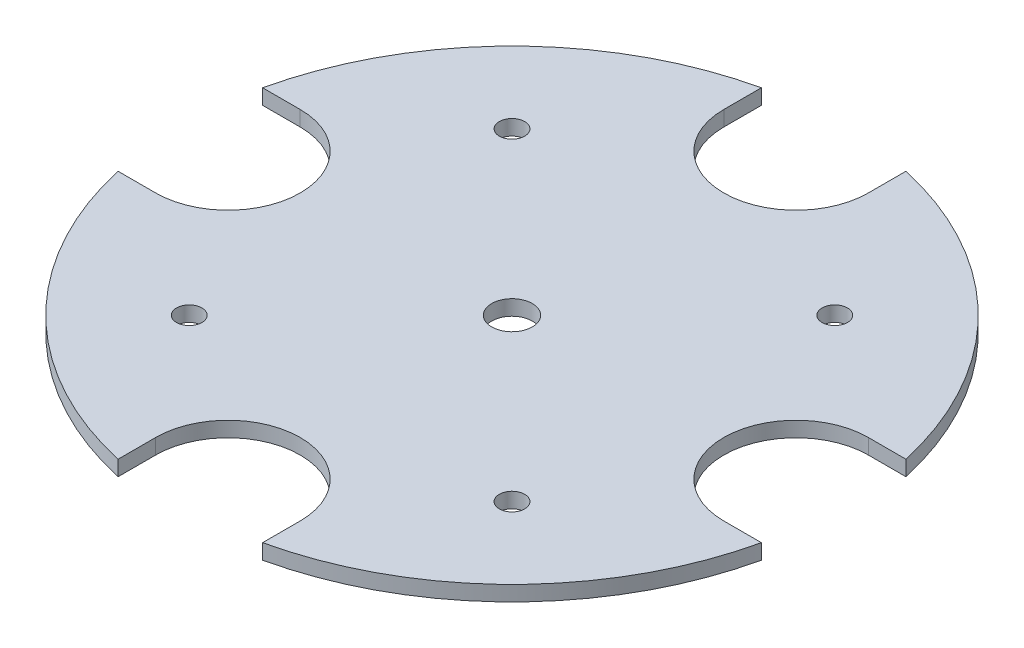
ISO-10303-21;
HEADER;
FILE_DESCRIPTION(('STEP AP214'),'2;1');
FILE_NAME('part.step','',(''),(''),'','','');
FILE_SCHEMA(('AUTOMOTIVE_DESIGN { 1 0 10303 214 1 1 1 1 }'));
ENDSEC;
DATA;
#1=APPLICATION_CONTEXT('core data for automotive mechanical design processes');
#2=APPLICATION_PROTOCOL_DEFINITION('international standard','automotive_design',2000,#1);
#3=PRODUCT_CONTEXT('',#1,'mechanical');
#4=PRODUCT('Part','Part','',(#3));
#5=PRODUCT_RELATED_PRODUCT_CATEGORY('part','',(#4));
#6=PRODUCT_DEFINITION_FORMATION('','',#4);
#7=PRODUCT_DEFINITION_CONTEXT('part definition',#1,'design');
#8=PRODUCT_DEFINITION('design','',#6,#7);
#9=PRODUCT_DEFINITION_SHAPE('','',#8);
#10=(LENGTH_UNIT() NAMED_UNIT(*) SI_UNIT(.MILLI.,.METRE.));
#11=(NAMED_UNIT(*) PLANE_ANGLE_UNIT() SI_UNIT($,.RADIAN.));
#12=(NAMED_UNIT(*) SI_UNIT($,.STERADIAN.) SOLID_ANGLE_UNIT());
#13=UNCERTAINTY_MEASURE_WITH_UNIT(LENGTH_MEASURE(1.E-05),#10,'distance_accuracy_value','');
#14=(GEOMETRIC_REPRESENTATION_CONTEXT(3) GLOBAL_UNCERTAINTY_ASSIGNED_CONTEXT((#13)) GLOBAL_UNIT_ASSIGNED_CONTEXT((#10,
#11,#12)) REPRESENTATION_CONTEXT('',''));
#15=CARTESIAN_POINT('',(0.,0.,0.));
#16=DIRECTION('',(0.,0.,1.));
#17=DIRECTION('',(1.,0.,0.));
#18=AXIS2_PLACEMENT_3D('',#15,#16,#17);
#19=CARTESIAN_POINT('',(-56.,3.,0.));
#20=DIRECTION('',(0.,1.,0.));
#21=DIRECTION('',(0.,0.,1.));
#22=AXIS2_PLACEMENT_3D('',#19,#20,#21);
#23=PLANE('',#22);
#24=CARTESIAN_POINT('',(31.8198051533964,3.,31.8198051533928));
#25=DIRECTION('',(0.,1.,0.));
#26=DIRECTION('',(0.,0.,1.));
#27=AXIS2_PLACEMENT_3D('',#24,#25,#26);
#28=CIRCLE('',#27,2.50000000000252);
#29=CARTESIAN_POINT('',(31.8198051533964,3.,34.3198051533954));
#30=VERTEX_POINT('',#29);
#31=EDGE_CURVE('E346',#30,#30,#28,.T.);
#32=ORIENTED_EDGE('',*,*,#31,.F.);
#33=EDGE_LOOP('',(#32));
#34=FACE_BOUND('',#33,.T.);
#35=CARTESIAN_POINT('',(0.,3.,0.));
#36=DIRECTION('',(0.,1.,0.));
#37=DIRECTION('',(0.,0.,1.));
#38=AXIS2_PLACEMENT_3D('',#35,#36,#37);
#39=CIRCLE('',#38,4.);
#40=CARTESIAN_POINT('',(0.,3.,4.));
#41=VERTEX_POINT('',#40);
#42=EDGE_CURVE('E358',#41,#41,#39,.T.);
#43=ORIENTED_EDGE('',*,*,#42,.F.);
#44=EDGE_LOOP('',(#43));
#45=FACE_BOUND('',#44,.T.);
#46=CARTESIAN_POINT('',(-56.,3.,0.));
#47=DIRECTION('',(0.,-1.,0.));
#48=DIRECTION('',(0.,0.,1.));
#49=AXIS2_PLACEMENT_3D('',#46,#47,#48);
#50=CIRCLE('',#49,14.25);
#51=CARTESIAN_POINT('',(-56.,3.,-14.25));
#52=VERTEX_POINT('',#51);
#53=CARTESIAN_POINT('',(-56.,3.,14.25));
#54=VERTEX_POINT('',#53);
#55=EDGE_CURVE('E208',#52,#54,#50,.T.);
#56=ORIENTED_EDGE('',*,*,#55,.T.);
#57=DIRECTION('',(-1.,0.,0.));
#58=VECTOR('',#57,1.);
#59=CARTESIAN_POINT('',(-56.,3.,14.25));
#60=LINE('',#59,#58);
#61=CARTESIAN_POINT('',(-63.4187472282448,3.,14.25));
#62=VERTEX_POINT('',#61);
#63=EDGE_CURVE('E116',#54,#62,#60,.T.);
#64=ORIENTED_EDGE('',*,*,#63,.T.);
#65=CARTESIAN_POINT('',(0.,3.,0.));
#66=DIRECTION('',(0.,1.,0.));
#67=DIRECTION('',(0.,0.,1.));
#68=AXIS2_PLACEMENT_3D('',#65,#66,#67);
#69=CIRCLE('',#68,65.);
#70=CARTESIAN_POINT('',(-14.2500000000007,3.,63.4187472282446));
#71=VERTEX_POINT('',#70);
#72=EDGE_CURVE('E247',#62,#71,#69,.T.);
#73=ORIENTED_EDGE('',*,*,#72,.T.);
#74=DIRECTION('',(0.,0.,-1.));
#75=VECTOR('',#74,1.);
#76=CARTESIAN_POINT('',(-14.2500000000006,3.,55.9999999999999));
#77=LINE('',#76,#75);
#78=CARTESIAN_POINT('',(-14.2500000000006,3.,55.9999999999999));
#79=VERTEX_POINT('',#78);
#80=EDGE_CURVE('E266',#71,#79,#77,.T.);
#81=ORIENTED_EDGE('',*,*,#80,.T.);
#82=CARTESIAN_POINT('',(-5.86568864925646E-13,3.,56.));
#83=DIRECTION('',(0.,-1.,0.));
#84=DIRECTION('',(0.,0.,1.));
#85=AXIS2_PLACEMENT_3D('',#82,#83,#84);
#86=CIRCLE('',#85,14.25);
#87=CARTESIAN_POINT('',(14.2499999999994,3.,56.0000000000002));
#88=VERTEX_POINT('',#87);
#89=EDGE_CURVE('E263',#79,#88,#86,.T.);
#90=ORIENTED_EDGE('',*,*,#89,.T.);
#91=DIRECTION('',(0.,0.,1.));
#92=VECTOR('',#91,1.);
#93=CARTESIAN_POINT('',(14.2499999999994,3.,56.0000000000002));
#94=LINE('',#93,#92);
#95=CARTESIAN_POINT('',(14.2499999999993,3.,63.4187472282449));
#96=VERTEX_POINT('',#95);
#97=EDGE_CURVE('E265',#88,#96,#94,.T.);
#98=ORIENTED_EDGE('',*,*,#97,.T.);
#99=CARTESIAN_POINT('',(0.,3.,0.));
#100=DIRECTION('',(0.,1.,0.));
#101=DIRECTION('',(0.,0.,1.));
#102=AXIS2_PLACEMENT_3D('',#99,#100,#101);
#103=CIRCLE('',#102,65.);
#104=CARTESIAN_POINT('',(63.4187472282447,3.,14.2500000000004));
#105=VERTEX_POINT('',#104);
#106=EDGE_CURVE('E268',#96,#105,#103,.T.);
#107=ORIENTED_EDGE('',*,*,#106,.T.);
#108=DIRECTION('',(-1.,0.,0.));
#109=VECTOR('',#108,1.);
#110=CARTESIAN_POINT('',(55.9999999999999,3.,14.2500000000004));
#111=LINE('',#110,#109);
#112=CARTESIAN_POINT('',(56.,3.,14.2500000000004));
#113=VERTEX_POINT('',#112);
#114=EDGE_CURVE('E274',#105,#113,#111,.T.);
#115=ORIENTED_EDGE('',*,*,#114,.T.);
#116=CARTESIAN_POINT('',(56.,3.,3.91045909950431E-13));
#117=DIRECTION('',(0.,-1.,0.));
#118=DIRECTION('',(0.,0.,1.));
#119=AXIS2_PLACEMENT_3D('',#116,#117,#118);
#120=CIRCLE('',#119,14.25);
#121=CARTESIAN_POINT('',(56.0000000000001,3.,-14.2499999999996));
#122=VERTEX_POINT('',#121);
#123=EDGE_CURVE('E276',#113,#122,#120,.T.);
#124=ORIENTED_EDGE('',*,*,#123,.T.);
#125=DIRECTION('',(1.,0.,0.));
#126=VECTOR('',#125,1.);
#127=CARTESIAN_POINT('',(56.0000000000001,3.,-14.2499999999996));
#128=LINE('',#127,#126);
#129=CARTESIAN_POINT('',(63.4187472282448,3.,-14.2499999999996));
#130=VERTEX_POINT('',#129);
#131=EDGE_CURVE('E278',#122,#130,#128,.T.);
#132=ORIENTED_EDGE('',*,*,#131,.T.);
#133=CARTESIAN_POINT('',(0.,3.,0.));
#134=DIRECTION('',(0.,1.,0.));
#135=DIRECTION('',(0.,0.,1.));
#136=AXIS2_PLACEMENT_3D('',#133,#134,#135);
#137=CIRCLE('',#136,65.);
#138=CARTESIAN_POINT('',(14.2500000000002,3.,-63.4187472282447));
#139=VERTEX_POINT('',#138);
#140=EDGE_CURVE('E280',#130,#139,#137,.T.);
#141=ORIENTED_EDGE('',*,*,#140,.T.);
#142=DIRECTION('',(0.,0.,1.));
#143=VECTOR('',#142,1.);
#144=CARTESIAN_POINT('',(14.2500000000002,3.,-56.));
#145=LINE('',#144,#143);
#146=CARTESIAN_POINT('',(14.2500000000002,3.,-56.));
#147=VERTEX_POINT('',#146);
#148=EDGE_CURVE('E282',#139,#147,#145,.T.);
#149=ORIENTED_EDGE('',*,*,#148,.T.);
#150=CARTESIAN_POINT('',(1.95522954975215E-13,3.,-56.));
#151=DIRECTION('',(0.,-1.,0.));
#152=DIRECTION('',(0.,0.,1.));
#153=AXIS2_PLACEMENT_3D('',#150,#151,#152);
#154=CIRCLE('',#153,14.25);
#155=CARTESIAN_POINT('',(-14.2499999999998,3.,-56.));
#156=VERTEX_POINT('',#155);
#157=EDGE_CURVE('E159',#147,#156,#154,.T.);
#158=ORIENTED_EDGE('',*,*,#157,.T.);
#159=DIRECTION('',(0.,0.,-1.));
#160=VECTOR('',#159,1.);
#161=CARTESIAN_POINT('',(-14.2499999999998,3.,-56.));
#162=LINE('',#161,#160);
#163=CARTESIAN_POINT('',(-14.2499999999998,3.,-63.4187472282448));
#164=VERTEX_POINT('',#163);
#165=EDGE_CURVE('E153',#156,#164,#162,.T.);
#166=ORIENTED_EDGE('',*,*,#165,.T.);
#167=CARTESIAN_POINT('',(0.,3.,0.));
#168=DIRECTION('',(0.,1.,0.));
#169=DIRECTION('',(0.,0.,1.));
#170=AXIS2_PLACEMENT_3D('',#167,#168,#169);
#171=CIRCLE('',#170,65.);
#172=CARTESIAN_POINT('',(-63.4187472282448,3.,-14.25));
#173=VERTEX_POINT('',#172);
#174=EDGE_CURVE('E157',#164,#173,#171,.T.);
#175=ORIENTED_EDGE('',*,*,#174,.T.);
#176=DIRECTION('',(1.,0.,0.));
#177=VECTOR('',#176,1.);
#178=CARTESIAN_POINT('',(-56.,3.,-14.25));
#179=LINE('',#178,#177);
#180=EDGE_CURVE('E49',#173,#52,#179,.T.);
#181=ORIENTED_EDGE('',*,*,#180,.T.);
#182=EDGE_LOOP('',(#56,#64,#73,#81,#90,#98,#107,#115,#124,#132,#141,#149,#158,#166,#175,#181));
#183=FACE_BOUND('',#182,.T.);
#184=CARTESIAN_POINT('',(-31.8198051533946,3.,-31.8198051533946));
#185=DIRECTION('',(0.,1.,0.));
#186=DIRECTION('',(0.,0.,1.));
#187=AXIS2_PLACEMENT_3D('',#184,#185,#186);
#188=CIRCLE('',#187,2.5);
#189=CARTESIAN_POINT('',(-31.8198051533946,3.,-29.3198051533946));
#190=VERTEX_POINT('',#189);
#191=EDGE_CURVE('E181',#190,#190,#188,.T.);
#192=ORIENTED_EDGE('',*,*,#191,.F.);
#193=EDGE_LOOP('',(#192));
#194=FACE_BOUND('',#193,.T.);
#195=CARTESIAN_POINT('',(31.8198051533946,3.,-31.8198051533964));
#196=DIRECTION('',(0.,1.,0.));
#197=DIRECTION('',(0.,0.,1.));
#198=AXIS2_PLACEMENT_3D('',#195,#196,#197);
#199=CIRCLE('',#198,2.50000000000185);
#200=CARTESIAN_POINT('',(31.8198051533946,3.,-29.3198051533946));
#201=VERTEX_POINT('',#200);
#202=EDGE_CURVE('E352',#201,#201,#199,.T.);
#203=ORIENTED_EDGE('',*,*,#202,.F.);
#204=EDGE_LOOP('',(#203));
#205=FACE_BOUND('',#204,.T.);
#206=CARTESIAN_POINT('',(-31.8198051533928,3.,31.8198051533946));
#207=DIRECTION('',(0.,1.,0.));
#208=DIRECTION('',(0.,0.,1.));
#209=AXIS2_PLACEMENT_3D('',#206,#207,#208);
#210=CIRCLE('',#209,2.50000000000095);
#211=CARTESIAN_POINT('',(-31.8198051533928,3.,34.3198051533956));
#212=VERTEX_POINT('',#211);
#213=EDGE_CURVE('E337',#212,#212,#210,.T.);
#214=ORIENTED_EDGE('',*,*,#213,.F.);
#215=EDGE_LOOP('',(#214));
#216=FACE_BOUND('',#215,.T.);
#217=ADVANCED_FACE('F32',(#34,#45,#183,#194,#205,#216),#23,.T.);
#218=CARTESIAN_POINT('',(-56.,0.,0.));
#219=DIRECTION('',(0.,1.,0.));
#220=DIRECTION('',(0.,0.,1.));
#221=AXIS2_PLACEMENT_3D('',#218,#219,#220);
#222=PLANE('',#221);
#223=CARTESIAN_POINT('',(-56.,0.,0.));
#224=DIRECTION('',(0.,-1.,0.));
#225=DIRECTION('',(0.,0.,1.));
#226=AXIS2_PLACEMENT_3D('',#223,#224,#225);
#227=CIRCLE('',#226,14.25);
#228=CARTESIAN_POINT('',(-56.,0.,-14.25));
#229=VERTEX_POINT('',#228);
#230=CARTESIAN_POINT('',(-56.,0.,14.25));
#231=VERTEX_POINT('',#230);
#232=EDGE_CURVE('E177',#229,#231,#227,.T.);
#233=ORIENTED_EDGE('',*,*,#232,.F.);
#234=DIRECTION('',(1.,0.,0.));
#235=VECTOR('',#234,1.);
#236=CARTESIAN_POINT('',(-56.,0.,-14.25));
#237=LINE('',#236,#235);
#238=CARTESIAN_POINT('',(-63.4187472282448,0.,-14.25));
#239=VERTEX_POINT('',#238);
#240=EDGE_CURVE('E108',#239,#229,#237,.T.);
#241=ORIENTED_EDGE('',*,*,#240,.F.);
#242=CARTESIAN_POINT('',(0.,0.,0.));
#243=DIRECTION('',(0.,1.,0.));
#244=DIRECTION('',(0.,0.,1.));
#245=AXIS2_PLACEMENT_3D('',#242,#243,#244);
#246=CIRCLE('',#245,65.);
#247=CARTESIAN_POINT('',(-14.2499999999998,0.,-63.4187472282448));
#248=VERTEX_POINT('',#247);
#249=EDGE_CURVE('E102',#248,#239,#246,.T.);
#250=ORIENTED_EDGE('',*,*,#249,.F.);
#251=DIRECTION('',(0.,0.,-1.));
#252=VECTOR('',#251,1.);
#253=CARTESIAN_POINT('',(-14.2499999999998,0.,-56.));
#254=LINE('',#253,#252);
#255=CARTESIAN_POINT('',(-14.2499999999998,0.,-56.));
#256=VERTEX_POINT('',#255);
#257=EDGE_CURVE('E167',#256,#248,#254,.T.);
#258=ORIENTED_EDGE('',*,*,#257,.F.);
#259=CARTESIAN_POINT('',(1.95522954975215E-13,0.,-56.));
#260=DIRECTION('',(0.,-1.,0.));
#261=DIRECTION('',(0.,0.,1.));
#262=AXIS2_PLACEMENT_3D('',#259,#260,#261);
#263=CIRCLE('',#262,14.25);
#264=CARTESIAN_POINT('',(14.2500000000002,0.,-56.));
#265=VERTEX_POINT('',#264);
#266=EDGE_CURVE('E203',#265,#256,#263,.T.);
#267=ORIENTED_EDGE('',*,*,#266,.F.);
#268=DIRECTION('',(0.,0.,1.));
#269=VECTOR('',#268,1.);
#270=CARTESIAN_POINT('',(14.2500000000002,0.,-56.));
#271=LINE('',#270,#269);
#272=CARTESIAN_POINT('',(14.2500000000002,0.,-63.4187472282447));
#273=VERTEX_POINT('',#272);
#274=EDGE_CURVE('E201',#273,#265,#271,.T.);
#275=ORIENTED_EDGE('',*,*,#274,.F.);
#276=CARTESIAN_POINT('',(0.,0.,0.));
#277=DIRECTION('',(0.,1.,0.));
#278=DIRECTION('',(0.,0.,1.));
#279=AXIS2_PLACEMENT_3D('',#276,#277,#278);
#280=CIRCLE('',#279,65.);
#281=CARTESIAN_POINT('',(63.4187472282448,0.,-14.2499999999996));
#282=VERTEX_POINT('',#281);
#283=EDGE_CURVE('E199',#282,#273,#280,.T.);
#284=ORIENTED_EDGE('',*,*,#283,.F.);
#285=DIRECTION('',(1.,0.,0.));
#286=VECTOR('',#285,1.);
#287=CARTESIAN_POINT('',(56.0000000000001,0.,-14.2499999999996));
#288=LINE('',#287,#286);
#289=CARTESIAN_POINT('',(56.0000000000001,0.,-14.2499999999996));
#290=VERTEX_POINT('',#289);
#291=EDGE_CURVE('E197',#290,#282,#288,.T.);
#292=ORIENTED_EDGE('',*,*,#291,.F.);
#293=CARTESIAN_POINT('',(56.,0.,3.91045909950431E-13));
#294=DIRECTION('',(0.,-1.,0.));
#295=DIRECTION('',(0.,0.,1.));
#296=AXIS2_PLACEMENT_3D('',#293,#294,#295);
#297=CIRCLE('',#296,14.25);
#298=CARTESIAN_POINT('',(56.,0.,14.2500000000004));
#299=VERTEX_POINT('',#298);
#300=EDGE_CURVE('E195',#299,#290,#297,.T.);
#301=ORIENTED_EDGE('',*,*,#300,.F.);
#302=DIRECTION('',(-1.,0.,0.));
#303=VECTOR('',#302,1.);
#304=CARTESIAN_POINT('',(55.9999999999999,0.,14.2500000000004));
#305=LINE('',#304,#303);
#306=CARTESIAN_POINT('',(63.4187472282447,0.,14.2500000000004));
#307=VERTEX_POINT('',#306);
#308=EDGE_CURVE('E193',#307,#299,#305,.T.);
#309=ORIENTED_EDGE('',*,*,#308,.F.);
#310=CARTESIAN_POINT('',(0.,0.,0.));
#311=DIRECTION('',(0.,1.,0.));
#312=DIRECTION('',(0.,0.,1.));
#313=AXIS2_PLACEMENT_3D('',#310,#311,#312);
#314=CIRCLE('',#313,65.);
#315=CARTESIAN_POINT('',(14.2499999999993,0.,63.4187472282449));
#316=VERTEX_POINT('',#315);
#317=EDGE_CURVE('E191',#316,#307,#314,.T.);
#318=ORIENTED_EDGE('',*,*,#317,.F.);
#319=DIRECTION('',(0.,0.,1.));
#320=VECTOR('',#319,1.);
#321=CARTESIAN_POINT('',(14.2499999999994,0.,56.0000000000002));
#322=LINE('',#321,#320);
#323=CARTESIAN_POINT('',(14.2499999999994,0.,56.0000000000002));
#324=VERTEX_POINT('',#323);
#325=EDGE_CURVE('E189',#324,#316,#322,.T.);
#326=ORIENTED_EDGE('',*,*,#325,.F.);
#327=CARTESIAN_POINT('',(-5.86568864925646E-13,0.,56.));
#328=DIRECTION('',(0.,-1.,0.));
#329=DIRECTION('',(0.,0.,1.));
#330=AXIS2_PLACEMENT_3D('',#327,#328,#329);
#331=CIRCLE('',#330,14.25);
#332=CARTESIAN_POINT('',(-14.2500000000006,0.,55.9999999999999));
#333=VERTEX_POINT('',#332);
#334=EDGE_CURVE('E187',#333,#324,#331,.T.);
#335=ORIENTED_EDGE('',*,*,#334,.F.);
#336=DIRECTION('',(0.,0.,-1.));
#337=VECTOR('',#336,1.);
#338=CARTESIAN_POINT('',(-14.2500000000006,0.,55.9999999999999));
#339=LINE('',#338,#337);
#340=CARTESIAN_POINT('',(-14.2500000000007,0.,63.4187472282446));
#341=VERTEX_POINT('',#340);
#342=EDGE_CURVE('E185',#341,#333,#339,.T.);
#343=ORIENTED_EDGE('',*,*,#342,.F.);
#344=CARTESIAN_POINT('',(0.,0.,0.));
#345=DIRECTION('',(0.,1.,0.));
#346=DIRECTION('',(0.,0.,1.));
#347=AXIS2_PLACEMENT_3D('',#344,#345,#346);
#348=CIRCLE('',#347,65.);
#349=CARTESIAN_POINT('',(-63.4187472282448,0.,14.25));
#350=VERTEX_POINT('',#349);
#351=EDGE_CURVE('E183',#350,#341,#348,.T.);
#352=ORIENTED_EDGE('',*,*,#351,.F.);
#353=DIRECTION('',(-1.,0.,0.));
#354=VECTOR('',#353,1.);
#355=CARTESIAN_POINT('',(-56.,0.,14.25));
#356=LINE('',#355,#354);
#357=EDGE_CURVE('E180',#231,#350,#356,.T.);
#358=ORIENTED_EDGE('',*,*,#357,.F.);
#359=EDGE_LOOP('',(#233,#241,#250,#258,#267,#275,#284,#292,#301,#309,#318,#326,#335,#343,#352,#358));
#360=FACE_BOUND('',#359,.T.);
#361=CARTESIAN_POINT('',(-31.8198051533946,0.,-31.8198051533946));
#362=DIRECTION('',(0.,1.,0.));
#363=DIRECTION('',(0.,0.,1.));
#364=AXIS2_PLACEMENT_3D('',#361,#362,#363);
#365=CIRCLE('',#364,2.5);
#366=CARTESIAN_POINT('',(-31.8198051533946,0.,-29.3198051533946));
#367=VERTEX_POINT('',#366);
#368=EDGE_CURVE('E361',#367,#367,#365,.T.);
#369=ORIENTED_EDGE('',*,*,#368,.T.);
#370=EDGE_LOOP('',(#369));
#371=FACE_BOUND('',#370,.T.);
#372=CARTESIAN_POINT('',(0.,0.,0.));
#373=DIRECTION('',(0.,1.,0.));
#374=DIRECTION('',(0.,0.,1.));
#375=AXIS2_PLACEMENT_3D('',#372,#373,#374);
#376=CIRCLE('',#375,4.);
#377=CARTESIAN_POINT('',(0.,0.,4.));
#378=VERTEX_POINT('',#377);
#379=EDGE_CURVE('E355',#378,#378,#376,.T.);
#380=ORIENTED_EDGE('',*,*,#379,.T.);
#381=EDGE_LOOP('',(#380));
#382=FACE_BOUND('',#381,.T.);
#383=CARTESIAN_POINT('',(31.8198051533946,0.,-31.8198051533964));
#384=DIRECTION('',(0.,1.,0.));
#385=DIRECTION('',(0.,0.,1.));
#386=AXIS2_PLACEMENT_3D('',#383,#384,#385);
#387=CIRCLE('',#386,2.50000000000185);
#388=CARTESIAN_POINT('',(31.8198051533946,0.,-29.3198051533946));
#389=VERTEX_POINT('',#388);
#390=EDGE_CURVE('E349',#389,#389,#387,.T.);
#391=ORIENTED_EDGE('',*,*,#390,.T.);
#392=EDGE_LOOP('',(#391));
#393=FACE_BOUND('',#392,.T.);
#394=CARTESIAN_POINT('',(31.8198051533964,0.,31.8198051533928));
#395=DIRECTION('',(0.,1.,0.));
#396=DIRECTION('',(0.,0.,1.));
#397=AXIS2_PLACEMENT_3D('',#394,#395,#396);
#398=CIRCLE('',#397,2.50000000000252);
#399=CARTESIAN_POINT('',(31.8198051533964,0.,34.3198051533954));
#400=VERTEX_POINT('',#399);
#401=EDGE_CURVE('E343',#400,#400,#398,.T.);
#402=ORIENTED_EDGE('',*,*,#401,.T.);
#403=EDGE_LOOP('',(#402));
#404=FACE_BOUND('',#403,.T.);
#405=CARTESIAN_POINT('',(-31.8198051533928,0.,31.8198051533946));
#406=DIRECTION('',(0.,1.,0.));
#407=DIRECTION('',(0.,0.,1.));
#408=AXIS2_PLACEMENT_3D('',#405,#406,#407);
#409=CIRCLE('',#408,2.50000000000095);
#410=CARTESIAN_POINT('',(-31.8198051533928,0.,34.3198051533956));
#411=VERTEX_POINT('',#410);
#412=EDGE_CURVE('E340',#411,#411,#409,.T.);
#413=ORIENTED_EDGE('',*,*,#412,.T.);
#414=EDGE_LOOP('',(#413));
#415=FACE_BOUND('',#414,.T.);
#416=ADVANCED_FACE('F251',(#360,#371,#382,#393,#404,#415),#222,.F.);
#417=CARTESIAN_POINT('',(-56.,3.,0.));
#418=DIRECTION('',(0.,-1.,0.));
#419=DIRECTION('',(0.,0.,-1.));
#420=AXIS2_PLACEMENT_3D('',#417,#418,#419);
#421=CYLINDRICAL_SURFACE('',#420,14.25);
#422=ORIENTED_EDGE('',*,*,#232,.T.);
#423=DIRECTION('',(0.,-1.,0.));
#424=VECTOR('',#423,1.);
#425=CARTESIAN_POINT('',(-56.,3.,14.25));
#426=LINE('',#425,#424);
#427=EDGE_CURVE('E11',#54,#231,#426,.T.);
#428=ORIENTED_EDGE('',*,*,#427,.F.);
#429=ORIENTED_EDGE('',*,*,#55,.F.);
#430=DIRECTION('',(0.,-1.,0.));
#431=VECTOR('',#430,1.);
#432=CARTESIAN_POINT('',(-56.,3.,-14.25));
#433=LINE('',#432,#431);
#434=EDGE_CURVE('E173',#52,#229,#433,.T.);
#435=ORIENTED_EDGE('',*,*,#434,.T.);
#436=EDGE_LOOP('',(#422,#428,#429,#435));
#437=FACE_BOUND('',#436,.T.);
#438=ADVANCED_FACE('F34',(#437),#421,.F.);
#439=CARTESIAN_POINT('',(-56.,3.,14.25));
#440=DIRECTION('',(0.,0.,1.));
#441=DIRECTION('',(1.,0.,0.));
#442=AXIS2_PLACEMENT_3D('',#439,#440,#441);
#443=PLANE('',#442);
#444=ORIENTED_EDGE('',*,*,#357,.T.);
#445=DIRECTION('',(0.,-1.,0.));
#446=VECTOR('',#445,1.);
#447=CARTESIAN_POINT('',(-63.4187472282448,3.,14.25));
#448=LINE('',#447,#446);
#449=EDGE_CURVE('E41',#62,#350,#448,.T.);
#450=ORIENTED_EDGE('',*,*,#449,.F.);
#451=ORIENTED_EDGE('',*,*,#63,.F.);
#452=ORIENTED_EDGE('',*,*,#427,.T.);
#453=EDGE_LOOP('',(#444,#450,#451,#452));
#454=FACE_BOUND('',#453,.T.);
#455=ADVANCED_FACE('F520',(#454),#443,.F.);
#456=CARTESIAN_POINT('',(0.,3.,0.));
#457=DIRECTION('',(0.,-1.,0.));
#458=DIRECTION('',(0.,0.,-1.));
#459=AXIS2_PLACEMENT_3D('',#456,#457,#458);
#460=CYLINDRICAL_SURFACE('',#459,65.);
#461=ORIENTED_EDGE('',*,*,#351,.T.);
#462=DIRECTION('',(0.,-1.,0.));
#463=VECTOR('',#462,1.);
#464=CARTESIAN_POINT('',(-14.2500000000007,3.,63.4187472282446));
#465=LINE('',#464,#463);
#466=EDGE_CURVE('E239',#71,#341,#465,.T.);
#467=ORIENTED_EDGE('',*,*,#466,.F.);
#468=ORIENTED_EDGE('',*,*,#72,.F.);
#469=ORIENTED_EDGE('',*,*,#449,.T.);
#470=EDGE_LOOP('',(#461,#467,#468,#469));
#471=FACE_BOUND('',#470,.T.);
#472=ADVANCED_FACE('F245',(#471),#460,.T.);
#473=CARTESIAN_POINT('',(-14.2500000000006,3.,55.9999999999999));
#474=DIRECTION('',(-1.,0.,0.));
#475=DIRECTION('',(0.,0.,1.));
#476=AXIS2_PLACEMENT_3D('',#473,#474,#475);
#477=PLANE('',#476);
#478=ORIENTED_EDGE('',*,*,#342,.T.);
#479=DIRECTION('',(0.,-1.,0.));
#480=VECTOR('',#479,1.);
#481=CARTESIAN_POINT('',(-14.2500000000006,3.,55.9999999999999));
#482=LINE('',#481,#480);
#483=EDGE_CURVE('E236',#79,#333,#482,.T.);
#484=ORIENTED_EDGE('',*,*,#483,.F.);
#485=ORIENTED_EDGE('',*,*,#80,.F.);
#486=ORIENTED_EDGE('',*,*,#466,.T.);
#487=EDGE_LOOP('',(#478,#484,#485,#486));
#488=FACE_BOUND('',#487,.T.);
#489=ADVANCED_FACE('F257',(#488),#477,.F.);
#490=CARTESIAN_POINT('',(-5.86568864925646E-13,3.,56.));
#491=DIRECTION('',(0.,-1.,0.));
#492=DIRECTION('',(0.,0.,-1.));
#493=AXIS2_PLACEMENT_3D('',#490,#491,#492);
#494=CYLINDRICAL_SURFACE('',#493,14.25);
#495=ORIENTED_EDGE('',*,*,#334,.T.);
#496=DIRECTION('',(0.,-1.,0.));
#497=VECTOR('',#496,1.);
#498=CARTESIAN_POINT('',(14.2499999999994,3.,56.0000000000002));
#499=LINE('',#498,#497);
#500=EDGE_CURVE('E233',#88,#324,#499,.T.);
#501=ORIENTED_EDGE('',*,*,#500,.F.);
#502=ORIENTED_EDGE('',*,*,#89,.F.);
#503=ORIENTED_EDGE('',*,*,#483,.T.);
#504=EDGE_LOOP('',(#495,#501,#502,#503));
#505=FACE_BOUND('',#504,.T.);
#506=ADVANCED_FACE('F261',(#505),#494,.F.);
#507=CARTESIAN_POINT('',(14.2499999999994,3.,56.0000000000002));
#508=DIRECTION('',(1.,0.,0.));
#509=DIRECTION('',(0.,0.,-1.));
#510=AXIS2_PLACEMENT_3D('',#507,#508,#509);
#511=PLANE('',#510);
#512=ORIENTED_EDGE('',*,*,#325,.T.);
#513=DIRECTION('',(0.,-1.,0.));
#514=VECTOR('',#513,1.);
#515=CARTESIAN_POINT('',(14.2499999999993,3.,63.4187472282449));
#516=LINE('',#515,#514);
#517=EDGE_CURVE('E230',#96,#316,#516,.T.);
#518=ORIENTED_EDGE('',*,*,#517,.F.);
#519=ORIENTED_EDGE('',*,*,#97,.F.);
#520=ORIENTED_EDGE('',*,*,#500,.T.);
#521=EDGE_LOOP('',(#512,#518,#519,#520));
#522=FACE_BOUND('',#521,.T.);
#523=ADVANCED_FACE('F485',(#522),#511,.F.);
#524=CARTESIAN_POINT('',(0.,3.,0.));
#525=DIRECTION('',(0.,-1.,0.));
#526=DIRECTION('',(0.,0.,-1.));
#527=AXIS2_PLACEMENT_3D('',#524,#525,#526);
#528=CYLINDRICAL_SURFACE('',#527,65.);
#529=ORIENTED_EDGE('',*,*,#317,.T.);
#530=DIRECTION('',(0.,-1.,0.));
#531=VECTOR('',#530,1.);
#532=CARTESIAN_POINT('',(63.4187472282447,3.,14.2500000000004));
#533=LINE('',#532,#531);
#534=EDGE_CURVE('E227',#105,#307,#533,.T.);
#535=ORIENTED_EDGE('',*,*,#534,.F.);
#536=ORIENTED_EDGE('',*,*,#106,.F.);
#537=ORIENTED_EDGE('',*,*,#517,.T.);
#538=EDGE_LOOP('',(#529,#535,#536,#537));
#539=FACE_BOUND('',#538,.T.);
#540=ADVANCED_FACE('F475',(#539),#528,.T.);
#541=CARTESIAN_POINT('',(55.9999999999999,3.,14.2500000000004));
#542=DIRECTION('',(0.,0.,1.));
#543=DIRECTION('',(1.,0.,0.));
#544=AXIS2_PLACEMENT_3D('',#541,#542,#543);
#545=PLANE('',#544);
#546=ORIENTED_EDGE('',*,*,#308,.T.);
#547=DIRECTION('',(0.,-1.,0.));
#548=VECTOR('',#547,1.);
#549=CARTESIAN_POINT('',(56.,3.,14.2500000000004));
#550=LINE('',#549,#548);
#551=EDGE_CURVE('E224',#113,#299,#550,.T.);
#552=ORIENTED_EDGE('',*,*,#551,.F.);
#553=ORIENTED_EDGE('',*,*,#114,.F.);
#554=ORIENTED_EDGE('',*,*,#534,.T.);
#555=EDGE_LOOP('',(#546,#552,#553,#554));
#556=FACE_BOUND('',#555,.T.);
#557=ADVANCED_FACE('F465',(#556),#545,.F.);
#558=CARTESIAN_POINT('',(56.,3.,3.91045909950431E-13));
#559=DIRECTION('',(0.,-1.,0.));
#560=DIRECTION('',(0.,0.,-1.));
#561=AXIS2_PLACEMENT_3D('',#558,#559,#560);
#562=CYLINDRICAL_SURFACE('',#561,14.25);
#563=ORIENTED_EDGE('',*,*,#300,.T.);
#564=DIRECTION('',(0.,-1.,0.));
#565=VECTOR('',#564,1.);
#566=CARTESIAN_POINT('',(56.0000000000001,3.,-14.2499999999996));
#567=LINE('',#566,#565);
#568=EDGE_CURVE('E221',#122,#290,#567,.T.);
#569=ORIENTED_EDGE('',*,*,#568,.F.);
#570=ORIENTED_EDGE('',*,*,#123,.F.);
#571=ORIENTED_EDGE('',*,*,#551,.T.);
#572=EDGE_LOOP('',(#563,#569,#570,#571));
#573=FACE_BOUND('',#572,.T.);
#574=ADVANCED_FACE('F455',(#573),#562,.F.);
#575=CARTESIAN_POINT('',(56.0000000000001,3.,-14.2499999999996));
#576=DIRECTION('',(0.,0.,-1.));
#577=DIRECTION('',(-1.,0.,0.));
#578=AXIS2_PLACEMENT_3D('',#575,#576,#577);
#579=PLANE('',#578);
#580=ORIENTED_EDGE('',*,*,#291,.T.);
#581=DIRECTION('',(0.,-1.,0.));
#582=VECTOR('',#581,1.);
#583=CARTESIAN_POINT('',(63.4187472282448,3.,-14.2499999999996));
#584=LINE('',#583,#582);
#585=EDGE_CURVE('E218',#130,#282,#584,.T.);
#586=ORIENTED_EDGE('',*,*,#585,.F.);
#587=ORIENTED_EDGE('',*,*,#131,.F.);
#588=ORIENTED_EDGE('',*,*,#568,.T.);
#589=EDGE_LOOP('',(#580,#586,#587,#588));
#590=FACE_BOUND('',#589,.T.);
#591=ADVANCED_FACE('F445',(#590),#579,.F.);
#592=CARTESIAN_POINT('',(0.,3.,0.));
#593=DIRECTION('',(0.,-1.,0.));
#594=DIRECTION('',(0.,0.,-1.));
#595=AXIS2_PLACEMENT_3D('',#592,#593,#594);
#596=CYLINDRICAL_SURFACE('',#595,65.);
#597=ORIENTED_EDGE('',*,*,#283,.T.);
#598=DIRECTION('',(0.,-1.,0.));
#599=VECTOR('',#598,1.);
#600=CARTESIAN_POINT('',(14.2500000000002,3.,-63.4187472282447));
#601=LINE('',#600,#599);
#602=EDGE_CURVE('E215',#139,#273,#601,.T.);
#603=ORIENTED_EDGE('',*,*,#602,.F.);
#604=ORIENTED_EDGE('',*,*,#140,.F.);
#605=ORIENTED_EDGE('',*,*,#585,.T.);
#606=EDGE_LOOP('',(#597,#603,#604,#605));
#607=FACE_BOUND('',#606,.T.);
#608=ADVANCED_FACE('F436',(#607),#596,.T.);
#609=CARTESIAN_POINT('',(14.2500000000002,3.,-56.));
#610=DIRECTION('',(1.,0.,0.));
#611=DIRECTION('',(0.,0.,-1.));
#612=AXIS2_PLACEMENT_3D('',#609,#610,#611);
#613=PLANE('',#612);
#614=ORIENTED_EDGE('',*,*,#274,.T.);
#615=DIRECTION('',(0.,-1.,0.));
#616=VECTOR('',#615,1.);
#617=CARTESIAN_POINT('',(14.2500000000002,3.,-56.));
#618=LINE('',#617,#616);
#619=EDGE_CURVE('E212',#147,#265,#618,.T.);
#620=ORIENTED_EDGE('',*,*,#619,.F.);
#621=ORIENTED_EDGE('',*,*,#148,.F.);
#622=ORIENTED_EDGE('',*,*,#602,.T.);
#623=EDGE_LOOP('',(#614,#620,#621,#622));
#624=FACE_BOUND('',#623,.T.);
#625=ADVANCED_FACE('F288',(#624),#613,.F.);
#626=CARTESIAN_POINT('',(1.95522954975215E-13,3.,-56.));
#627=DIRECTION('',(0.,-1.,0.));
#628=DIRECTION('',(0.,0.,-1.));
#629=AXIS2_PLACEMENT_3D('',#626,#627,#628);
#630=CYLINDRICAL_SURFACE('',#629,14.25);
#631=ORIENTED_EDGE('',*,*,#266,.T.);
#632=DIRECTION('',(0.,-1.,0.));
#633=VECTOR('',#632,1.);
#634=CARTESIAN_POINT('',(-14.2499999999998,3.,-56.));
#635=LINE('',#634,#633);
#636=EDGE_CURVE('E168',#156,#256,#635,.T.);
#637=ORIENTED_EDGE('',*,*,#636,.F.);
#638=ORIENTED_EDGE('',*,*,#157,.F.);
#639=ORIENTED_EDGE('',*,*,#619,.T.);
#640=EDGE_LOOP('',(#631,#637,#638,#639));
#641=FACE_BOUND('',#640,.T.);
#642=ADVANCED_FACE('F292',(#641),#630,.F.);
#643=CARTESIAN_POINT('',(-14.2499999999998,3.,-56.));
#644=DIRECTION('',(-1.,0.,0.));
#645=DIRECTION('',(0.,0.,1.));
#646=AXIS2_PLACEMENT_3D('',#643,#644,#645);
#647=PLANE('',#646);
#648=ORIENTED_EDGE('',*,*,#257,.T.);
#649=DIRECTION('',(0.,-1.,0.));
#650=VECTOR('',#649,1.);
#651=CARTESIAN_POINT('',(-14.2499999999998,3.,-63.4187472282448));
#652=LINE('',#651,#650);
#653=EDGE_CURVE('E164',#164,#248,#652,.T.);
#654=ORIENTED_EDGE('',*,*,#653,.F.);
#655=ORIENTED_EDGE('',*,*,#165,.F.);
#656=ORIENTED_EDGE('',*,*,#636,.T.);
#657=EDGE_LOOP('',(#648,#654,#655,#656));
#658=FACE_BOUND('',#657,.T.);
#659=ADVANCED_FACE('F165',(#658),#647,.F.);
#660=CARTESIAN_POINT('',(0.,3.,0.));
#661=DIRECTION('',(0.,-1.,0.));
#662=DIRECTION('',(0.,0.,-1.));
#663=AXIS2_PLACEMENT_3D('',#660,#661,#662);
#664=CYLINDRICAL_SURFACE('',#663,65.);
#665=ORIENTED_EDGE('',*,*,#249,.T.);
#666=DIRECTION('',(0.,-1.,0.));
#667=VECTOR('',#666,1.);
#668=CARTESIAN_POINT('',(-63.4187472282448,3.,-14.25));
#669=LINE('',#668,#667);
#670=EDGE_CURVE('E169',#173,#239,#669,.T.);
#671=ORIENTED_EDGE('',*,*,#670,.F.);
#672=ORIENTED_EDGE('',*,*,#174,.F.);
#673=ORIENTED_EDGE('',*,*,#653,.T.);
#674=EDGE_LOOP('',(#665,#671,#672,#673));
#675=FACE_BOUND('',#674,.T.);
#676=ADVANCED_FACE('F171',(#675),#664,.T.);
#677=CARTESIAN_POINT('',(-56.,3.,-14.25));
#678=DIRECTION('',(0.,0.,-1.));
#679=DIRECTION('',(-1.,0.,0.));
#680=AXIS2_PLACEMENT_3D('',#677,#678,#679);
#681=PLANE('',#680);
#682=ORIENTED_EDGE('',*,*,#240,.T.);
#683=ORIENTED_EDGE('',*,*,#434,.F.);
#684=ORIENTED_EDGE('',*,*,#180,.F.);
#685=ORIENTED_EDGE('',*,*,#670,.T.);
#686=EDGE_LOOP('',(#682,#683,#684,#685));
#687=FACE_BOUND('',#686,.T.);
#688=ADVANCED_FACE('F296',(#687),#681,.F.);
#689=CARTESIAN_POINT('',(-31.8198051533946,3.,-31.8198051533946));
#690=DIRECTION('',(0.,-1.,0.));
#691=DIRECTION('',(0.,0.,-1.));
#692=AXIS2_PLACEMENT_3D('',#689,#690,#691);
#693=CYLINDRICAL_SURFACE('',#692,2.5);
#694=ORIENTED_EDGE('',*,*,#191,.T.);
#695=EDGE_LOOP('',(#694));
#696=FACE_BOUND('',#695,.T.);
#697=ORIENTED_EDGE('',*,*,#368,.F.);
#698=EDGE_LOOP('',(#697));
#699=FACE_BOUND('',#698,.T.);
#700=ADVANCED_FACE('F298',(#696,#699),#693,.F.);
#701=CARTESIAN_POINT('',(0.,3.,0.));
#702=DIRECTION('',(0.,-1.,0.));
#703=DIRECTION('',(0.,0.,-1.));
#704=AXIS2_PLACEMENT_3D('',#701,#702,#703);
#705=CYLINDRICAL_SURFACE('',#704,4.);
#706=ORIENTED_EDGE('',*,*,#42,.T.);
#707=EDGE_LOOP('',(#706));
#708=FACE_BOUND('',#707,.T.);
#709=ORIENTED_EDGE('',*,*,#379,.F.);
#710=EDGE_LOOP('',(#709));
#711=FACE_BOUND('',#710,.T.);
#712=ADVANCED_FACE('F304',(#708,#711),#705,.F.);
#713=CARTESIAN_POINT('',(31.8198051533946,3.,-31.8198051533964));
#714=DIRECTION('',(0.,-1.,0.));
#715=DIRECTION('',(0.,0.,-1.));
#716=AXIS2_PLACEMENT_3D('',#713,#714,#715);
#717=CYLINDRICAL_SURFACE('',#716,2.50000000000185);
#718=ORIENTED_EDGE('',*,*,#202,.T.);
#719=EDGE_LOOP('',(#718));
#720=FACE_BOUND('',#719,.T.);
#721=ORIENTED_EDGE('',*,*,#390,.F.);
#722=EDGE_LOOP('',(#721));
#723=FACE_BOUND('',#722,.T.);
#724=ADVANCED_FACE('F320',(#720,#723),#717,.F.);
#725=CARTESIAN_POINT('',(31.8198051533964,3.,31.8198051533928));
#726=DIRECTION('',(0.,-1.,0.));
#727=DIRECTION('',(0.,0.,-1.));
#728=AXIS2_PLACEMENT_3D('',#725,#726,#727);
#729=CYLINDRICAL_SURFACE('',#728,2.50000000000252);
#730=ORIENTED_EDGE('',*,*,#31,.T.);
#731=EDGE_LOOP('',(#730));
#732=FACE_BOUND('',#731,.T.);
#733=ORIENTED_EDGE('',*,*,#401,.F.);
#734=EDGE_LOOP('',(#733));
#735=FACE_BOUND('',#734,.T.);
#736=ADVANCED_FACE('F324',(#732,#735),#729,.F.);
#737=CARTESIAN_POINT('',(-31.8198051533928,3.,31.8198051533946));
#738=DIRECTION('',(0.,-1.,0.));
#739=DIRECTION('',(0.,0.,-1.));
#740=AXIS2_PLACEMENT_3D('',#737,#738,#739);
#741=CYLINDRICAL_SURFACE('',#740,2.50000000000095);
#742=ORIENTED_EDGE('',*,*,#213,.T.);
#743=EDGE_LOOP('',(#742));
#744=FACE_BOUND('',#743,.T.);
#745=ORIENTED_EDGE('',*,*,#412,.F.);
#746=EDGE_LOOP('',(#745));
#747=FACE_BOUND('',#746,.T.);
#748=ADVANCED_FACE('F328',(#744,#747),#741,.F.);
#749=CLOSED_SHELL('',(#217,#416,#438,#455,#472,#489,#506,#523,#540,#557,#574,#591,#608,#625,
#642,#659,#676,#688,#700,#712,#724,#736,#748));
#750=MANIFOLD_SOLID_BREP('B2',#749);
#751=ADVANCED_BREP_SHAPE_REPRESENTATION('',(#18,#750),#14);
#752=SHAPE_DEFINITION_REPRESENTATION(#9,#751);
ENDSEC;
END-ISO-10303-21;
